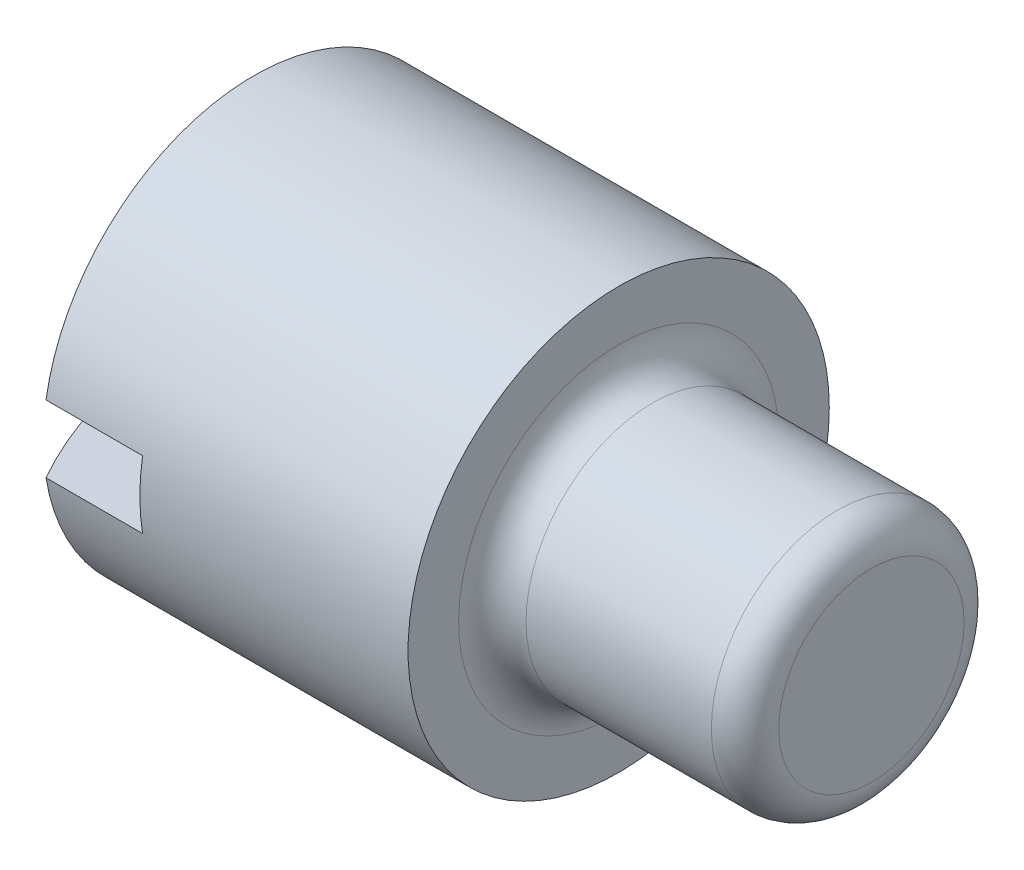
ISO-10303-21;
HEADER;
FILE_DESCRIPTION(('STEP AP214'),'2;1');
FILE_NAME('part.step','',(''),(''),'','','');
FILE_SCHEMA(('AUTOMOTIVE_DESIGN { 1 0 10303 214 1 1 1 1 }'));
ENDSEC;
DATA;
#1=APPLICATION_CONTEXT('core data for automotive mechanical design processes');
#2=APPLICATION_PROTOCOL_DEFINITION('international standard','automotive_design',2000,#1);
#3=PRODUCT_CONTEXT('',#1,'mechanical');
#4=PRODUCT('Part','Part','',(#3));
#5=PRODUCT_RELATED_PRODUCT_CATEGORY('part','',(#4));
#6=PRODUCT_DEFINITION_FORMATION('','',#4);
#7=PRODUCT_DEFINITION_CONTEXT('part definition',#1,'design');
#8=PRODUCT_DEFINITION('design','',#6,#7);
#9=PRODUCT_DEFINITION_SHAPE('','',#8);
#10=(LENGTH_UNIT() NAMED_UNIT(*) SI_UNIT(.MILLI.,.METRE.));
#11=(NAMED_UNIT(*) PLANE_ANGLE_UNIT() SI_UNIT($,.RADIAN.));
#12=(NAMED_UNIT(*) SI_UNIT($,.STERADIAN.) SOLID_ANGLE_UNIT());
#13=UNCERTAINTY_MEASURE_WITH_UNIT(LENGTH_MEASURE(1.E-05),#10,'distance_accuracy_value','');
#14=(GEOMETRIC_REPRESENTATION_CONTEXT(3) GLOBAL_UNCERTAINTY_ASSIGNED_CONTEXT((#13)) GLOBAL_UNIT_ASSIGNED_CONTEXT((#10,
#11,#12)) REPRESENTATION_CONTEXT('',''));
#15=CARTESIAN_POINT('',(0.,0.,0.));
#16=DIRECTION('',(0.,0.,1.));
#17=DIRECTION('',(1.,0.,0.));
#18=AXIS2_PLACEMENT_3D('',#15,#16,#17);
#19=CARTESIAN_POINT('',(0.,0.,0.));
#20=DIRECTION('',(0.,1.,0.));
#21=DIRECTION('',(0.,0.,1.));
#22=AXIS2_PLACEMENT_3D('',#19,#20,#21);
#23=SPHERICAL_SURFACE('',#22,5.);
#24=CARTESIAN_POINT('',(0.,0.400000000000001,0.));
#25=DIRECTION('',(0.,1.,0.));
#26=DIRECTION('',(-1.,0.,0.));
#27=AXIS2_PLACEMENT_3D('',#24,#25,#26);
#28=CIRCLE('',#27,4.98397431775085);
#29=CARTESIAN_POINT('',(-4.33012701892219,0.4,2.46779253585061));
#30=VERTEX_POINT('',#29);
#31=CARTESIAN_POINT('',(-4.33012701892219,0.4,-2.46779253585061));
#32=VERTEX_POINT('',#31);
#33=EDGE_CURVE('E65',#30,#32,#28,.F.);
#34=ORIENTED_EDGE('',*,*,#33,.F.);
#35=CARTESIAN_POINT('',(-4.33012701892219,0.,0.));
#36=DIRECTION('',(1.,0.,0.));
#37=DIRECTION('',(0.,0.,-1.));
#38=AXIS2_PLACEMENT_3D('',#35,#36,#37);
#39=CIRCLE('',#38,2.5);
#40=EDGE_CURVE('E109',#30,#32,#39,.F.);
#41=ORIENTED_EDGE('',*,*,#40,.T.);
#42=EDGE_LOOP('',(#34,#41));
#43=FACE_BOUND('',#42,.T.);
#44=ADVANCED_FACE('F42',(#43),#23,.T.);
#45=CARTESIAN_POINT('',(0.,0.,0.));
#46=DIRECTION('',(-1.,0.,0.));
#47=DIRECTION('',(0.,0.,1.));
#48=AXIS2_PLACEMENT_3D('',#45,#46,#47);
#49=PLANE('',#48);
#50=CARTESIAN_POINT('',(0.,0.,0.));
#51=DIRECTION('',(-1.,0.,0.));
#52=DIRECTION('',(0.,0.,1.));
#53=AXIS2_PLACEMENT_3D('',#50,#51,#52);
#54=CIRCLE('',#53,1.9);
#55=CARTESIAN_POINT('',(0.,0.,1.9));
#56=VERTEX_POINT('',#55);
#57=EDGE_CURVE('E120',#56,#56,#54,.T.);
#58=ORIENTED_EDGE('',*,*,#57,.T.);
#59=EDGE_LOOP('',(#58));
#60=FACE_BOUND('',#59,.T.);
#61=CARTESIAN_POINT('',(0.,0.,0.));
#62=DIRECTION('',(1.,0.,0.));
#63=DIRECTION('',(0.,0.,-1.));
#64=AXIS2_PLACEMENT_3D('',#61,#62,#63);
#65=CIRCLE('',#64,2.5);
#66=CARTESIAN_POINT('',(0.,0.,-2.5));
#67=VERTEX_POINT('',#66);
#68=EDGE_CURVE('E106',#67,#67,#65,.T.);
#69=ORIENTED_EDGE('',*,*,#68,.T.);
#70=EDGE_LOOP('',(#69));
#71=FACE_BOUND('',#70,.T.);
#72=ADVANCED_FACE('F131',(#60,#71),#49,.F.);
#73=CARTESIAN_POINT('',(3.,0.,0.));
#74=DIRECTION('',(-1.,0.,0.));
#75=DIRECTION('',(0.,0.,1.));
#76=AXIS2_PLACEMENT_3D('',#73,#74,#75);
#77=CYLINDRICAL_SURFACE('',#76,1.5);
#78=CARTESIAN_POINT('',(2.6,0.,0.));
#79=DIRECTION('',(1.,0.,0.));
#80=DIRECTION('',(0.,0.,-1.));
#81=AXIS2_PLACEMENT_3D('',#78,#79,#80);
#82=CIRCLE('',#81,1.5);
#83=CARTESIAN_POINT('',(2.60000000000001,0.,-1.49999999999998));
#84=VERTEX_POINT('',#83);
#85=EDGE_CURVE('E117',#84,#84,#82,.F.);
#86=ORIENTED_EDGE('',*,*,#85,.T.);
#87=EDGE_LOOP('',(#86));
#88=FACE_BOUND('',#87,.T.);
#89=CARTESIAN_POINT('',(0.4,0.,0.));
#90=DIRECTION('',(-1.,0.,0.));
#91=DIRECTION('',(0.,0.,1.));
#92=AXIS2_PLACEMENT_3D('',#89,#90,#91);
#93=CIRCLE('',#92,1.5);
#94=CARTESIAN_POINT('',(0.39999999999999,0.,1.5));
#95=VERTEX_POINT('',#94);
#96=EDGE_CURVE('E114',#95,#95,#93,.F.);
#97=ORIENTED_EDGE('',*,*,#96,.T.);
#98=EDGE_LOOP('',(#97));
#99=FACE_BOUND('',#98,.T.);
#100=ADVANCED_FACE('F137',(#88,#99),#77,.T.);
#101=CARTESIAN_POINT('',(3.,0.,0.));
#102=DIRECTION('',(1.,0.,0.));
#103=DIRECTION('',(0.,0.,-1.));
#104=AXIS2_PLACEMENT_3D('',#101,#102,#103);
#105=PLANE('',#104);
#106=CARTESIAN_POINT('',(3.,0.,0.));
#107=DIRECTION('',(1.,0.,0.));
#108=DIRECTION('',(0.,0.,-1.));
#109=AXIS2_PLACEMENT_3D('',#106,#107,#108);
#110=CIRCLE('',#109,1.1);
#111=CARTESIAN_POINT('',(3.00000000000001,0.,-1.09999999999998));
#112=VERTEX_POINT('',#111);
#113=EDGE_CURVE('E111',#112,#112,#110,.T.);
#114=ORIENTED_EDGE('',*,*,#113,.T.);
#115=EDGE_LOOP('',(#114));
#116=FACE_BOUND('',#115,.T.);
#117=ADVANCED_FACE('F156',(#116),#105,.T.);
#118=CARTESIAN_POINT('',(2.6,0.,0.));
#119=DIRECTION('',(1.,0.,0.));
#120=DIRECTION('',(0.,0.,-1.));
#121=AXIS2_PLACEMENT_3D('',#118,#119,#120);
#122=TOROIDAL_SURFACE('',#121,1.1,0.4);
#123=ORIENTED_EDGE('',*,*,#85,.F.);
#124=EDGE_LOOP('',(#123));
#125=FACE_BOUND('',#124,.T.);
#126=ORIENTED_EDGE('',*,*,#113,.F.);
#127=EDGE_LOOP('',(#126));
#128=FACE_BOUND('',#127,.T.);
#129=ADVANCED_FACE('F151',(#125,#128),#122,.T.);
#130=CARTESIAN_POINT('',(0.4,0.,0.));
#131=DIRECTION('',(-1.,0.,0.));
#132=DIRECTION('',(0.,0.,1.));
#133=AXIS2_PLACEMENT_3D('',#130,#131,#132);
#134=TOROIDAL_SURFACE('',#133,1.9,0.4);
#135=ORIENTED_EDGE('',*,*,#57,.F.);
#136=EDGE_LOOP('',(#135));
#137=FACE_BOUND('',#136,.T.);
#138=ORIENTED_EDGE('',*,*,#96,.F.);
#139=EDGE_LOOP('',(#138));
#140=FACE_BOUND('',#139,.T.);
#141=ADVANCED_FACE('F44',(#137,#140),#134,.F.);
#142=CARTESIAN_POINT('',(-43.,0.,0.));
#143=DIRECTION('',(1.,0.,0.));
#144=DIRECTION('',(0.,0.,-1.));
#145=AXIS2_PLACEMENT_3D('',#142,#143,#144);
#146=CYLINDRICAL_SURFACE('',#145,2.5);
#147=DIRECTION('',(1.,0.,0.));
#148=VECTOR('',#147,1.);
#149=CARTESIAN_POINT('',(-43.,0.399999999999989,-2.46779253585062));
#150=LINE('',#149,#148);
#151=CARTESIAN_POINT('',(-3.18397431775085,0.4,-2.46779253585061));
#152=VERTEX_POINT('',#151);
#153=EDGE_CURVE('E99',#32,#152,#150,.T.);
#154=ORIENTED_EDGE('',*,*,#153,.F.);
#155=ORIENTED_EDGE('',*,*,#40,.F.);
#156=DIRECTION('',(1.,0.,0.));
#157=VECTOR('',#156,1.);
#158=CARTESIAN_POINT('',(-43.,0.399999999999989,2.46779253585062));
#159=LINE('',#158,#157);
#160=CARTESIAN_POINT('',(-3.18397431775085,0.4,2.46779253585061));
#161=VERTEX_POINT('',#160);
#162=EDGE_CURVE('E101',#161,#30,#159,.F.);
#163=ORIENTED_EDGE('',*,*,#162,.F.);
#164=CARTESIAN_POINT('',(-3.18397431775085,0.,0.));
#165=DIRECTION('',(1.,0.,0.));
#166=DIRECTION('',(0.,0.,-1.));
#167=AXIS2_PLACEMENT_3D('',#164,#165,#166);
#168=CIRCLE('',#167,2.5);
#169=CARTESIAN_POINT('',(-3.18397431775085,-0.400000000000001,2.46779253585061));
#170=VERTEX_POINT('',#169);
#171=EDGE_CURVE('E46',#170,#161,#168,.F.);
#172=ORIENTED_EDGE('',*,*,#171,.F.);
#173=DIRECTION('',(1.,0.,0.));
#174=VECTOR('',#173,1.);
#175=CARTESIAN_POINT('',(-43.,-0.400000000000001,2.46779253585061));
#176=LINE('',#175,#174);
#177=CARTESIAN_POINT('',(-4.33012701892219,-0.400000000000001,2.46779253585061));
#178=VERTEX_POINT('',#177);
#179=EDGE_CURVE('E92',#178,#170,#176,.T.);
#180=ORIENTED_EDGE('',*,*,#179,.F.);
#181=CARTESIAN_POINT('',(-4.33012701892219,-0.400000000000001,-2.46779253585061));
#182=VERTEX_POINT('',#181);
#183=EDGE_CURVE('E98',#182,#178,#39,.F.);
#184=ORIENTED_EDGE('',*,*,#183,.F.);
#185=DIRECTION('',(1.,0.,0.));
#186=VECTOR('',#185,1.);
#187=CARTESIAN_POINT('',(-43.,-0.400000000000001,-2.46779253585061));
#188=LINE('',#187,#186);
#189=CARTESIAN_POINT('',(-3.18397431775085,-0.400000000000001,-2.46779253585061));
#190=VERTEX_POINT('',#189);
#191=EDGE_CURVE('E57',#190,#182,#188,.F.);
#192=ORIENTED_EDGE('',*,*,#191,.F.);
#193=EDGE_CURVE('E12',#152,#190,#168,.F.);
#194=ORIENTED_EDGE('',*,*,#193,.F.);
#195=EDGE_LOOP('',(#154,#155,#163,#172,#180,#184,#192,#194));
#196=FACE_BOUND('',#195,.T.);
#197=ORIENTED_EDGE('',*,*,#68,.F.);
#198=EDGE_LOOP('',(#197));
#199=FACE_BOUND('',#198,.T.);
#200=ADVANCED_FACE('F95',(#196,#199),#146,.T.);
#201=CARTESIAN_POINT('',(0.,-0.400000000000001,0.));
#202=DIRECTION('',(0.,-1.,0.));
#203=DIRECTION('',(0.,0.,-1.));
#204=AXIS2_PLACEMENT_3D('',#201,#202,#203);
#205=CIRCLE('',#204,4.98397431775085);
#206=EDGE_CURVE('E123',#182,#178,#205,.F.);
#207=ORIENTED_EDGE('',*,*,#206,.F.);
#208=ORIENTED_EDGE('',*,*,#183,.T.);
#209=EDGE_LOOP('',(#207,#208));
#210=FACE_BOUND('',#209,.T.);
#211=ADVANCED_FACE('F133',(#210),#23,.T.);
#212=CARTESIAN_POINT('',(-5.59353081375554,0.399999999999999,-21.5));
#213=DIRECTION('',(0.,1.,0.));
#214=DIRECTION('',(-1.,0.,0.));
#215=AXIS2_PLACEMENT_3D('',#212,#213,#214);
#216=PLANE('',#215);
#217=ORIENTED_EDGE('',*,*,#162,.T.);
#218=ORIENTED_EDGE('',*,*,#33,.T.);
#219=ORIENTED_EDGE('',*,*,#153,.T.);
#220=DIRECTION('',(0.,0.,1.));
#221=VECTOR('',#220,1.);
#222=CARTESIAN_POINT('',(-3.18397431775085,0.4,-21.5));
#223=LINE('',#222,#221);
#224=EDGE_CURVE('E88',#152,#161,#223,.T.);
#225=ORIENTED_EDGE('',*,*,#224,.T.);
#226=EDGE_LOOP('',(#217,#218,#219,#225));
#227=FACE_BOUND('',#226,.T.);
#228=ADVANCED_FACE('F125',(#227),#216,.F.);
#229=CARTESIAN_POINT('',(-3.18397431775085,0.4,-21.5));
#230=DIRECTION('',(1.,0.,0.));
#231=DIRECTION('',(0.,0.,-1.));
#232=AXIS2_PLACEMENT_3D('',#229,#230,#231);
#233=PLANE('',#232);
#234=ORIENTED_EDGE('',*,*,#171,.T.);
#235=ORIENTED_EDGE('',*,*,#224,.F.);
#236=ORIENTED_EDGE('',*,*,#193,.T.);
#237=DIRECTION('',(0.,0.,1.));
#238=VECTOR('',#237,1.);
#239=CARTESIAN_POINT('',(-3.18397431775085,-0.400000000000001,-21.5));
#240=LINE('',#239,#238);
#241=EDGE_CURVE('E85',#190,#170,#240,.T.);
#242=ORIENTED_EDGE('',*,*,#241,.T.);
#243=EDGE_LOOP('',(#234,#235,#236,#242));
#244=FACE_BOUND('',#243,.T.);
#245=ADVANCED_FACE('F84',(#244),#233,.F.);
#246=CARTESIAN_POINT('',(-5.59353081375554,-0.400000000000001,-21.5));
#247=DIRECTION('',(0.,-1.,0.));
#248=DIRECTION('',(0.,0.,-1.));
#249=AXIS2_PLACEMENT_3D('',#246,#247,#248);
#250=PLANE('',#249);
#251=ORIENTED_EDGE('',*,*,#191,.T.);
#252=ORIENTED_EDGE('',*,*,#206,.T.);
#253=ORIENTED_EDGE('',*,*,#179,.T.);
#254=ORIENTED_EDGE('',*,*,#241,.F.);
#255=EDGE_LOOP('',(#251,#252,#253,#254));
#256=FACE_BOUND('',#255,.T.);
#257=ADVANCED_FACE('F90',(#256),#250,.F.);
#258=CLOSED_SHELL('',(#44,#72,#100,#117,#129,#141,#200,#211,#228,#245,#257));
#259=MANIFOLD_SOLID_BREP('B2',#258);
#260=ADVANCED_BREP_SHAPE_REPRESENTATION('',(#18,#259),#14);
#261=SHAPE_DEFINITION_REPRESENTATION(#9,#260);
ENDSEC;
END-ISO-10303-21;
